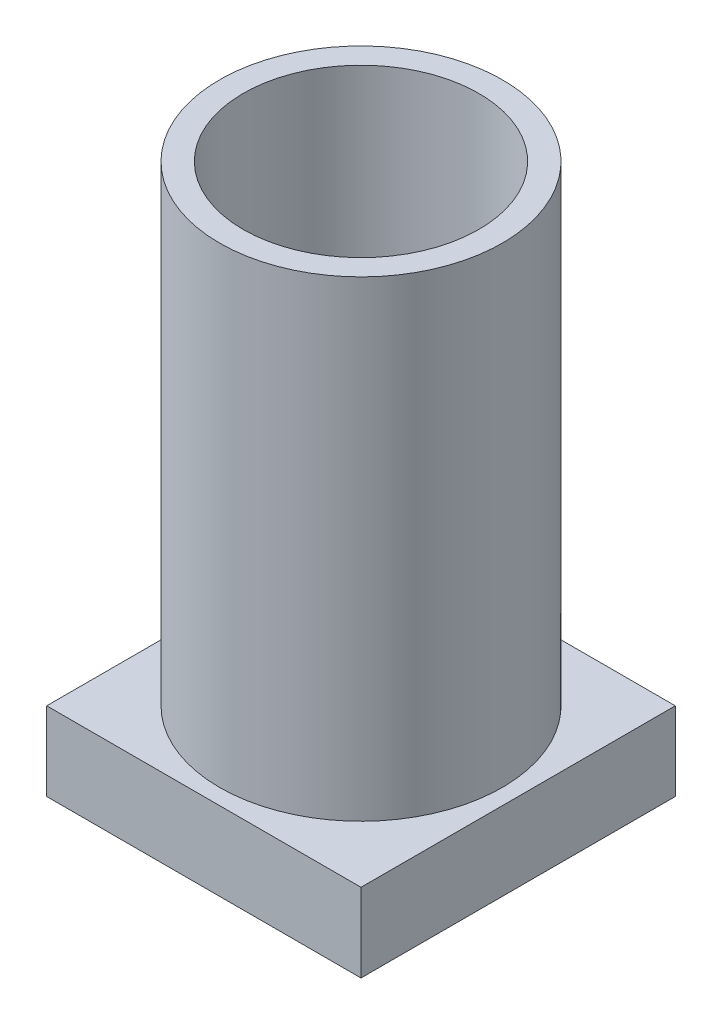
ISO-10303-21;
HEADER;
FILE_DESCRIPTION(('STEP AP214'),'2;1');
FILE_NAME('part.step','',(''),(''),'','','');
FILE_SCHEMA(('AUTOMOTIVE_DESIGN { 1 0 10303 214 1 1 1 1 }'));
ENDSEC;
DATA;
#1=APPLICATION_CONTEXT('core data for automotive mechanical design processes');
#2=APPLICATION_PROTOCOL_DEFINITION('international standard','automotive_design',2000,#1);
#3=PRODUCT_CONTEXT('',#1,'mechanical');
#4=PRODUCT('Part','Part','',(#3));
#5=PRODUCT_RELATED_PRODUCT_CATEGORY('part','',(#4));
#6=PRODUCT_DEFINITION_FORMATION('','',#4);
#7=PRODUCT_DEFINITION_CONTEXT('part definition',#1,'design');
#8=PRODUCT_DEFINITION('design','',#6,#7);
#9=PRODUCT_DEFINITION_SHAPE('','',#8);
#10=(LENGTH_UNIT() NAMED_UNIT(*) SI_UNIT(.MILLI.,.METRE.));
#11=(NAMED_UNIT(*) PLANE_ANGLE_UNIT() SI_UNIT($,.RADIAN.));
#12=(NAMED_UNIT(*) SI_UNIT($,.STERADIAN.) SOLID_ANGLE_UNIT());
#13=UNCERTAINTY_MEASURE_WITH_UNIT(LENGTH_MEASURE(1.E-05),#10,'distance_accuracy_value','');
#14=(GEOMETRIC_REPRESENTATION_CONTEXT(3) GLOBAL_UNCERTAINTY_ASSIGNED_CONTEXT((#13)) GLOBAL_UNIT_ASSIGNED_CONTEXT((#10,
#11,#12)) REPRESENTATION_CONTEXT('',''));
#15=CARTESIAN_POINT('',(0.,0.,0.));
#16=DIRECTION('',(0.,0.,1.));
#17=DIRECTION('',(1.,0.,0.));
#18=AXIS2_PLACEMENT_3D('',#15,#16,#17);
#19=CARTESIAN_POINT('',(0.,10.,0.));
#20=DIRECTION('',(1.,0.,0.));
#21=DIRECTION('',(0.,0.,-1.));
#22=AXIS2_PLACEMENT_3D('',#19,#20,#21);
#23=PLANE('',#22);
#24=DIRECTION('',(0.,0.,1.));
#25=VECTOR('',#24,1.);
#26=CARTESIAN_POINT('',(0.,0.,0.));
#27=LINE('',#26,#25);
#28=CARTESIAN_POINT('',(0.,0.,0.));
#29=VERTEX_POINT('',#28);
#30=CARTESIAN_POINT('',(0.,0.,40.));
#31=VERTEX_POINT('',#30);
#32=EDGE_CURVE('E107',#29,#31,#27,.T.);
#33=ORIENTED_EDGE('',*,*,#32,.T.);
#34=DIRECTION('',(0.,-1.,0.));
#35=VECTOR('',#34,1.);
#36=CARTESIAN_POINT('',(0.,10.,40.));
#37=LINE('',#36,#35);
#38=CARTESIAN_POINT('',(0.,10.,40.));
#39=VERTEX_POINT('',#38);
#40=EDGE_CURVE('E49',#39,#31,#37,.T.);
#41=ORIENTED_EDGE('',*,*,#40,.F.);
#42=DIRECTION('',(0.,0.,1.));
#43=VECTOR('',#42,1.);
#44=CARTESIAN_POINT('',(0.,10.,0.));
#45=LINE('',#44,#43);
#46=CARTESIAN_POINT('',(0.,10.,0.));
#47=VERTEX_POINT('',#46);
#48=EDGE_CURVE('E93',#47,#39,#45,.T.);
#49=ORIENTED_EDGE('',*,*,#48,.F.);
#50=DIRECTION('',(0.,-1.,0.));
#51=VECTOR('',#50,1.);
#52=CARTESIAN_POINT('',(0.,10.,0.));
#53=LINE('',#52,#51);
#54=EDGE_CURVE('E103',#47,#29,#53,.T.);
#55=ORIENTED_EDGE('',*,*,#54,.T.);
#56=EDGE_LOOP('',(#33,#41,#49,#55));
#57=FACE_BOUND('',#56,.T.);
#58=ADVANCED_FACE('F41',(#57),#23,.F.);
#59=CARTESIAN_POINT('',(0.,10.,40.));
#60=DIRECTION('',(0.,0.,-1.));
#61=DIRECTION('',(-1.,0.,0.));
#62=AXIS2_PLACEMENT_3D('',#59,#60,#61);
#63=PLANE('',#62);
#64=DIRECTION('',(1.,0.,0.));
#65=VECTOR('',#64,1.);
#66=CARTESIAN_POINT('',(0.,0.,40.));
#67=LINE('',#66,#65);
#68=CARTESIAN_POINT('',(40.,0.,40.));
#69=VERTEX_POINT('',#68);
#70=EDGE_CURVE('E98',#31,#69,#67,.T.);
#71=ORIENTED_EDGE('',*,*,#70,.T.);
#72=DIRECTION('',(0.,-1.,0.));
#73=VECTOR('',#72,1.);
#74=CARTESIAN_POINT('',(40.,10.,40.));
#75=LINE('',#74,#73);
#76=CARTESIAN_POINT('',(40.,10.,40.));
#77=VERTEX_POINT('',#76);
#78=EDGE_CURVE('E96',#77,#69,#75,.T.);
#79=ORIENTED_EDGE('',*,*,#78,.F.);
#80=DIRECTION('',(1.,0.,0.));
#81=VECTOR('',#80,1.);
#82=CARTESIAN_POINT('',(0.,10.,40.));
#83=LINE('',#82,#81);
#84=EDGE_CURVE('E88',#39,#77,#83,.T.);
#85=ORIENTED_EDGE('',*,*,#84,.F.);
#86=ORIENTED_EDGE('',*,*,#40,.T.);
#87=EDGE_LOOP('',(#71,#79,#85,#86));
#88=FACE_BOUND('',#87,.T.);
#89=ADVANCED_FACE('F97',(#88),#63,.F.);
#90=CARTESIAN_POINT('',(40.,10.,0.));
#91=DIRECTION('',(-1.,0.,0.));
#92=DIRECTION('',(0.,0.,1.));
#93=AXIS2_PLACEMENT_3D('',#90,#91,#92);
#94=PLANE('',#93);
#95=DIRECTION('',(0.,0.,-1.));
#96=VECTOR('',#95,1.);
#97=CARTESIAN_POINT('',(40.,0.,0.));
#98=LINE('',#97,#96);
#99=CARTESIAN_POINT('',(40.,0.,0.));
#100=VERTEX_POINT('',#99);
#101=EDGE_CURVE('E74',#69,#100,#98,.T.);
#102=ORIENTED_EDGE('',*,*,#101,.T.);
#103=DIRECTION('',(0.,-1.,0.));
#104=VECTOR('',#103,1.);
#105=CARTESIAN_POINT('',(40.,10.,0.));
#106=LINE('',#105,#104);
#107=CARTESIAN_POINT('',(40.,10.,0.));
#108=VERTEX_POINT('',#107);
#109=EDGE_CURVE('E99',#108,#100,#106,.T.);
#110=ORIENTED_EDGE('',*,*,#109,.F.);
#111=DIRECTION('',(0.,0.,-1.));
#112=VECTOR('',#111,1.);
#113=CARTESIAN_POINT('',(40.,10.,0.));
#114=LINE('',#113,#112);
#115=EDGE_CURVE('E91',#77,#108,#114,.T.);
#116=ORIENTED_EDGE('',*,*,#115,.F.);
#117=ORIENTED_EDGE('',*,*,#78,.T.);
#118=EDGE_LOOP('',(#102,#110,#116,#117));
#119=FACE_BOUND('',#118,.T.);
#120=ADVANCED_FACE('F101',(#119),#94,.F.);
#121=CARTESIAN_POINT('',(0.,10.,0.));
#122=DIRECTION('',(0.,0.,1.));
#123=DIRECTION('',(1.,0.,0.));
#124=AXIS2_PLACEMENT_3D('',#121,#122,#123);
#125=PLANE('',#124);
#126=DIRECTION('',(-1.,0.,0.));
#127=VECTOR('',#126,1.);
#128=CARTESIAN_POINT('',(0.,0.,0.));
#129=LINE('',#128,#127);
#130=EDGE_CURVE('E80',#100,#29,#129,.T.);
#131=ORIENTED_EDGE('',*,*,#130,.T.);
#132=ORIENTED_EDGE('',*,*,#54,.F.);
#133=DIRECTION('',(-1.,0.,0.));
#134=VECTOR('',#133,1.);
#135=CARTESIAN_POINT('',(0.,10.,0.));
#136=LINE('',#135,#134);
#137=EDGE_CURVE('E57',#108,#47,#136,.T.);
#138=ORIENTED_EDGE('',*,*,#137,.F.);
#139=ORIENTED_EDGE('',*,*,#109,.T.);
#140=EDGE_LOOP('',(#131,#132,#138,#139));
#141=FACE_BOUND('',#140,.T.);
#142=ADVANCED_FACE('F130',(#141),#125,.F.);
#143=CARTESIAN_POINT('',(0.,10.,0.));
#144=DIRECTION('',(0.,1.,0.));
#145=DIRECTION('',(0.,0.,1.));
#146=AXIS2_PLACEMENT_3D('',#143,#144,#145);
#147=PLANE('',#146);
#148=CARTESIAN_POINT('',(20.,10.,20.));
#149=DIRECTION('',(0.,1.,0.));
#150=DIRECTION('',(0.,0.,1.));
#151=AXIS2_PLACEMENT_3D('',#148,#149,#150);
#152=CIRCLE('',#151,18.);
#153=CARTESIAN_POINT('',(20.,10.,38.));
#154=VERTEX_POINT('',#153);
#155=EDGE_CURVE('E192',#154,#154,#152,.T.);
#156=ORIENTED_EDGE('',*,*,#155,.F.);
#157=EDGE_LOOP('',(#156));
#158=FACE_BOUND('',#157,.T.);
#159=ORIENTED_EDGE('',*,*,#48,.T.);
#160=ORIENTED_EDGE('',*,*,#84,.T.);
#161=ORIENTED_EDGE('',*,*,#115,.T.);
#162=ORIENTED_EDGE('',*,*,#137,.T.);
#163=EDGE_LOOP('',(#159,#160,#161,#162));
#164=FACE_BOUND('',#163,.T.);
#165=ADVANCED_FACE('F89',(#158,#164),#147,.T.);
#166=CARTESIAN_POINT('',(0.,0.,0.));
#167=DIRECTION('',(0.,1.,0.));
#168=DIRECTION('',(0.,0.,1.));
#169=AXIS2_PLACEMENT_3D('',#166,#167,#168);
#170=PLANE('',#169);
#171=ORIENTED_EDGE('',*,*,#32,.F.);
#172=ORIENTED_EDGE('',*,*,#130,.F.);
#173=ORIENTED_EDGE('',*,*,#101,.F.);
#174=ORIENTED_EDGE('',*,*,#70,.F.);
#175=EDGE_LOOP('',(#171,#172,#173,#174));
#176=FACE_BOUND('',#175,.T.);
#177=ADVANCED_FACE('F118',(#176),#170,.F.);
#178=CARTESIAN_POINT('',(20.,70.,20.));
#179=DIRECTION('',(0.,1.,0.));
#180=DIRECTION('',(0.,0.,1.));
#181=AXIS2_PLACEMENT_3D('',#178,#179,#180);
#182=PLANE('',#181);
#183=CARTESIAN_POINT('',(20.,70.,20.));
#184=DIRECTION('',(0.,1.,0.));
#185=DIRECTION('',(0.,0.,1.));
#186=AXIS2_PLACEMENT_3D('',#183,#184,#185);
#187=CIRCLE('',#186,18.);
#188=CARTESIAN_POINT('',(20.,70.,38.));
#189=VERTEX_POINT('',#188);
#190=EDGE_CURVE('E110',#189,#189,#187,.T.);
#191=ORIENTED_EDGE('',*,*,#190,.T.);
#192=EDGE_LOOP('',(#191));
#193=FACE_BOUND('',#192,.T.);
#194=CARTESIAN_POINT('',(20.,70.,20.));
#195=DIRECTION('',(0.,1.,0.));
#196=DIRECTION('',(0.,0.,1.));
#197=AXIS2_PLACEMENT_3D('',#194,#195,#196);
#198=CIRCLE('',#197,15.);
#199=CARTESIAN_POINT('',(20.,70.,35.));
#200=VERTEX_POINT('',#199);
#201=EDGE_CURVE('E189',#200,#200,#198,.T.);
#202=ORIENTED_EDGE('',*,*,#201,.F.);
#203=EDGE_LOOP('',(#202));
#204=FACE_BOUND('',#203,.T.);
#205=ADVANCED_FACE('F120',(#193,#204),#182,.T.);
#206=CARTESIAN_POINT('',(20.,70.,20.));
#207=DIRECTION('',(0.,-1.,0.));
#208=DIRECTION('',(0.,0.,-1.));
#209=AXIS2_PLACEMENT_3D('',#206,#207,#208);
#210=CYLINDRICAL_SURFACE('',#209,18.);
#211=ORIENTED_EDGE('',*,*,#190,.F.);
#212=EDGE_LOOP('',(#211));
#213=FACE_BOUND('',#212,.T.);
#214=ORIENTED_EDGE('',*,*,#155,.T.);
#215=EDGE_LOOP('',(#214));
#216=FACE_BOUND('',#215,.T.);
#217=ADVANCED_FACE('F127',(#213,#216),#210,.T.);
#218=CARTESIAN_POINT('',(20.,70.,20.));
#219=DIRECTION('',(0.,-1.,0.));
#220=DIRECTION('',(0.,0.,-1.));
#221=AXIS2_PLACEMENT_3D('',#218,#219,#220);
#222=CYLINDRICAL_SURFACE('',#221,15.);
#223=ORIENTED_EDGE('',*,*,#201,.T.);
#224=EDGE_LOOP('',(#223));
#225=FACE_BOUND('',#224,.T.);
#226=CARTESIAN_POINT('',(20.,10.,20.));
#227=DIRECTION('',(0.,1.,0.));
#228=DIRECTION('',(0.,0.,1.));
#229=AXIS2_PLACEMENT_3D('',#226,#227,#228);
#230=CIRCLE('',#229,15.);
#231=CARTESIAN_POINT('',(20.,10.,35.));
#232=VERTEX_POINT('',#231);
#233=EDGE_CURVE('E11',#232,#232,#230,.F.);
#234=ORIENTED_EDGE('',*,*,#233,.T.);
#235=EDGE_LOOP('',(#234));
#236=FACE_BOUND('',#235,.T.);
#237=ADVANCED_FACE('F166',(#225,#236),#222,.F.);
#238=ORIENTED_EDGE('',*,*,#233,.F.);
#239=EDGE_LOOP('',(#238));
#240=FACE_BOUND('',#239,.T.);
#241=ADVANCED_FACE('F133',(#240),#147,.T.);
#242=CLOSED_SHELL('',(#58,#89,#120,#142,#165,#177,#205,#217,#237,#241));
#243=MANIFOLD_SOLID_BREP('B2',#242);
#244=ADVANCED_BREP_SHAPE_REPRESENTATION('',(#18,#243),#14);
#245=SHAPE_DEFINITION_REPRESENTATION(#9,#244);
ENDSEC;
END-ISO-10303-21;
